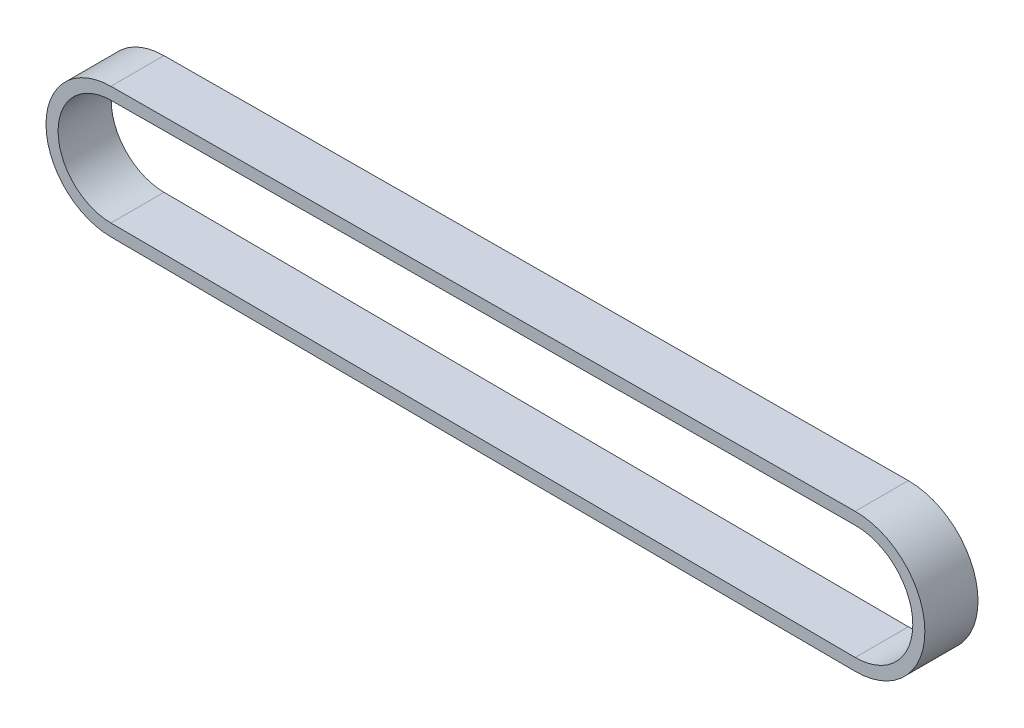
ISO-10303-21;
HEADER;
FILE_DESCRIPTION(('STEP AP214'),'2;1');
FILE_NAME('part.step','',(''),(''),'','','');
FILE_SCHEMA(('AUTOMOTIVE_DESIGN { 1 0 10303 214 1 1 1 1 }'));
ENDSEC;
DATA;
#1=APPLICATION_CONTEXT('core data for automotive mechanical design processes');
#2=APPLICATION_PROTOCOL_DEFINITION('international standard','automotive_design',2000,#1);
#3=PRODUCT_CONTEXT('',#1,'mechanical');
#4=PRODUCT('Part','Part','',(#3));
#5=PRODUCT_RELATED_PRODUCT_CATEGORY('part','',(#4));
#6=PRODUCT_DEFINITION_FORMATION('','',#4);
#7=PRODUCT_DEFINITION_CONTEXT('part definition',#1,'design');
#8=PRODUCT_DEFINITION('design','',#6,#7);
#9=PRODUCT_DEFINITION_SHAPE('','',#8);
#10=(LENGTH_UNIT() NAMED_UNIT(*) SI_UNIT(.MILLI.,.METRE.));
#11=(NAMED_UNIT(*) PLANE_ANGLE_UNIT() SI_UNIT($,.RADIAN.));
#12=(NAMED_UNIT(*) SI_UNIT($,.STERADIAN.) SOLID_ANGLE_UNIT());
#13=UNCERTAINTY_MEASURE_WITH_UNIT(LENGTH_MEASURE(1.E-05),#10,'distance_accuracy_value','');
#14=(GEOMETRIC_REPRESENTATION_CONTEXT(3) GLOBAL_UNCERTAINTY_ASSIGNED_CONTEXT((#13)) GLOBAL_UNIT_ASSIGNED_CONTEXT((#10,
#11,#12)) REPRESENTATION_CONTEXT('',''));
#15=CARTESIAN_POINT('',(0.,0.,0.));
#16=DIRECTION('',(0.,0.,1.));
#17=DIRECTION('',(1.,0.,0.));
#18=AXIS2_PLACEMENT_3D('',#15,#16,#17);
#19=CARTESIAN_POINT('',(-77.0499999974362,0.,11.));
#20=DIRECTION('',(0.,0.,1.));
#21=DIRECTION('',(1.,0.,0.));
#22=AXIS2_PLACEMENT_3D('',#19,#20,#21);
#23=PLANE('',#22);
#24=CARTESIAN_POINT('',(-77.0499999974362,0.,11.));
#25=DIRECTION('',(0.,0.,1.));
#26=DIRECTION('',(1.,0.,0.));
#27=AXIS2_PLACEMENT_3D('',#24,#25,#26);
#28=CIRCLE('',#27,13.4999999999998);
#29=CARTESIAN_POINT('',(-77.1244646307937,13.499794628748,11.));
#30=VERTEX_POINT('',#29);
#31=CARTESIAN_POINT('',(-77.1244646307937,-13.499794628748,11.));
#32=VERTEX_POINT('',#31);
#33=EDGE_CURVE('E137',#30,#32,#28,.T.);
#34=ORIENTED_EDGE('',*,*,#33,.T.);
#35=DIRECTION('',(0.999984787314682,-0.00551589876721858,0.));
#36=VECTOR('',#35,1.);
#37=CARTESIAN_POINT('',(-77.1244646307937,-13.499794628748,11.));
#38=LINE('',#37,#36);
#39=CARTESIAN_POINT('',(76.9708468501266,-14.3497816979656,11.));
#40=VERTEX_POINT('',#39);
#41=EDGE_CURVE('E140',#32,#40,#38,.T.);
#42=ORIENTED_EDGE('',*,*,#41,.T.);
#43=CARTESIAN_POINT('',(77.0499999974362,0.,11.));
#44=DIRECTION('',(0.,0.,1.));
#45=DIRECTION('',(1.,0.,0.));
#46=AXIS2_PLACEMENT_3D('',#43,#44,#45);
#47=CIRCLE('',#46,14.35);
#48=CARTESIAN_POINT('',(76.9708468501266,14.3497816979657,11.));
#49=VERTEX_POINT('',#48);
#50=EDGE_CURVE('E143',#40,#49,#47,.T.);
#51=ORIENTED_EDGE('',*,*,#50,.T.);
#52=DIRECTION('',(-0.999984787314682,-0.00551589876721897,0.));
#53=VECTOR('',#52,1.);
#54=CARTESIAN_POINT('',(-77.1244646307937,13.499794628748,11.));
#55=LINE('',#54,#53);
#56=EDGE_CURVE('E145',#49,#30,#55,.T.);
#57=ORIENTED_EDGE('',*,*,#56,.T.);
#58=EDGE_LOOP('',(#34,#42,#51,#57));
#59=FACE_BOUND('',#58,.T.);
#60=DIRECTION('',(-0.999984787314682,-0.00551589876721896,0.));
#61=VECTOR('',#60,1.);
#62=CARTESIAN_POINT('',(-77.1106748838756,10.9998326604614,11.));
#63=LINE('',#62,#61);
#64=CARTESIAN_POINT('',(76.9846365970447,11.849819729679,11.));
#65=VERTEX_POINT('',#64);
#66=CARTESIAN_POINT('',(-77.1106748838756,10.9998326604614,11.));
#67=VERTEX_POINT('',#66);
#68=EDGE_CURVE('E109',#65,#67,#63,.T.);
#69=ORIENTED_EDGE('',*,*,#68,.F.);
#70=CARTESIAN_POINT('',(77.0499999974362,0.,11.));
#71=DIRECTION('',(0.,0.,1.));
#72=DIRECTION('',(1.,0.,0.));
#73=AXIS2_PLACEMENT_3D('',#70,#71,#72);
#74=CIRCLE('',#73,11.85);
#75=CARTESIAN_POINT('',(76.9846365970447,-11.8498197296789,11.));
#76=VERTEX_POINT('',#75);
#77=EDGE_CURVE('E101',#76,#65,#74,.T.);
#78=ORIENTED_EDGE('',*,*,#77,.F.);
#79=DIRECTION('',(0.999984787314682,-0.00551589876721856,0.));
#80=VECTOR('',#79,1.);
#81=CARTESIAN_POINT('',(-77.1106748838756,-10.9998326604614,11.));
#82=LINE('',#81,#80);
#83=CARTESIAN_POINT('',(-77.1106748838756,-10.9998326604614,11.));
#84=VERTEX_POINT('',#83);
#85=EDGE_CURVE('E123',#84,#76,#82,.T.);
#86=ORIENTED_EDGE('',*,*,#85,.F.);
#87=CARTESIAN_POINT('',(-77.0499999974362,0.,11.));
#88=DIRECTION('',(0.,0.,1.));
#89=DIRECTION('',(1.,0.,0.));
#90=AXIS2_PLACEMENT_3D('',#87,#88,#89);
#91=CIRCLE('',#90,10.9999999999999);
#92=EDGE_CURVE('E121',#67,#84,#91,.T.);
#93=ORIENTED_EDGE('',*,*,#92,.F.);
#94=EDGE_LOOP('',(#69,#78,#86,#93));
#95=FACE_BOUND('',#94,.T.);
#96=ADVANCED_FACE('F36',(#59,#95),#23,.T.);
#97=CARTESIAN_POINT('',(-77.0499999974362,0.,0.));
#98=DIRECTION('',(0.,0.,1.));
#99=DIRECTION('',(1.,0.,0.));
#100=AXIS2_PLACEMENT_3D('',#97,#98,#99);
#101=PLANE('',#100);
#102=CARTESIAN_POINT('',(-77.0499999974362,0.,0.));
#103=DIRECTION('',(0.,0.,1.));
#104=DIRECTION('',(1.,0.,0.));
#105=AXIS2_PLACEMENT_3D('',#102,#103,#104);
#106=CIRCLE('',#105,13.4999999999998);
#107=CARTESIAN_POINT('',(-77.1244646307937,13.499794628748,0.));
#108=VERTEX_POINT('',#107);
#109=CARTESIAN_POINT('',(-77.1244646307937,-13.499794628748,0.));
#110=VERTEX_POINT('',#109);
#111=EDGE_CURVE('E117',#108,#110,#106,.T.);
#112=ORIENTED_EDGE('',*,*,#111,.F.);
#113=DIRECTION('',(-0.999984787314682,-0.00551589876721897,0.));
#114=VECTOR('',#113,1.);
#115=CARTESIAN_POINT('',(-77.1244646307937,13.499794628748,0.));
#116=LINE('',#115,#114);
#117=CARTESIAN_POINT('',(76.9708468501266,14.3497816979657,0.));
#118=VERTEX_POINT('',#117);
#119=EDGE_CURVE('E141',#118,#108,#116,.T.);
#120=ORIENTED_EDGE('',*,*,#119,.F.);
#121=CARTESIAN_POINT('',(77.0499999974362,0.,0.));
#122=DIRECTION('',(0.,0.,1.));
#123=DIRECTION('',(1.,0.,0.));
#124=AXIS2_PLACEMENT_3D('',#121,#122,#123);
#125=CIRCLE('',#124,14.35);
#126=CARTESIAN_POINT('',(76.9708468501266,-14.3497816979656,0.));
#127=VERTEX_POINT('',#126);
#128=EDGE_CURVE('E152',#127,#118,#125,.T.);
#129=ORIENTED_EDGE('',*,*,#128,.F.);
#130=DIRECTION('',(0.999984787314682,-0.00551589876721858,0.));
#131=VECTOR('',#130,1.);
#132=CARTESIAN_POINT('',(-77.1244646307937,-13.499794628748,0.));
#133=LINE('',#132,#131);
#134=EDGE_CURVE('E150',#110,#127,#133,.T.);
#135=ORIENTED_EDGE('',*,*,#134,.F.);
#136=EDGE_LOOP('',(#112,#120,#129,#135));
#137=FACE_BOUND('',#136,.T.);
#138=CARTESIAN_POINT('',(77.0499999974362,0.,0.));
#139=DIRECTION('',(0.,0.,1.));
#140=DIRECTION('',(1.,0.,0.));
#141=AXIS2_PLACEMENT_3D('',#138,#139,#140);
#142=CIRCLE('',#141,11.85);
#143=CARTESIAN_POINT('',(76.9846365970447,-11.8498197296789,0.));
#144=VERTEX_POINT('',#143);
#145=CARTESIAN_POINT('',(76.9846365970447,11.849819729679,0.));
#146=VERTEX_POINT('',#145);
#147=EDGE_CURVE('E59',#144,#146,#142,.T.);
#148=ORIENTED_EDGE('',*,*,#147,.T.);
#149=DIRECTION('',(-0.999984787314682,-0.00551589876721896,0.));
#150=VECTOR('',#149,1.);
#151=CARTESIAN_POINT('',(-77.1106748838756,10.9998326604614,0.));
#152=LINE('',#151,#150);
#153=CARTESIAN_POINT('',(-77.1106748838756,10.9998326604614,0.));
#154=VERTEX_POINT('',#153);
#155=EDGE_CURVE('E116',#146,#154,#152,.T.);
#156=ORIENTED_EDGE('',*,*,#155,.T.);
#157=CARTESIAN_POINT('',(-77.0499999974362,0.,0.));
#158=DIRECTION('',(0.,0.,1.));
#159=DIRECTION('',(1.,0.,0.));
#160=AXIS2_PLACEMENT_3D('',#157,#158,#159);
#161=CIRCLE('',#160,10.9999999999999);
#162=CARTESIAN_POINT('',(-77.1106748838756,-10.9998326604614,0.));
#163=VERTEX_POINT('',#162);
#164=EDGE_CURVE('E129',#154,#163,#161,.T.);
#165=ORIENTED_EDGE('',*,*,#164,.T.);
#166=DIRECTION('',(0.999984787314682,-0.00551589876721856,0.));
#167=VECTOR('',#166,1.);
#168=CARTESIAN_POINT('',(-77.1106748838756,-10.9998326604614,0.));
#169=LINE('',#168,#167);
#170=EDGE_CURVE('E110',#163,#144,#169,.T.);
#171=ORIENTED_EDGE('',*,*,#170,.T.);
#172=EDGE_LOOP('',(#148,#156,#165,#171));
#173=FACE_BOUND('',#172,.T.);
#174=ADVANCED_FACE('F170',(#137,#173),#101,.F.);
#175=CARTESIAN_POINT('',(-77.0499999974362,0.,11.));
#176=DIRECTION('',(0.,0.,-1.));
#177=DIRECTION('',(-1.,0.,0.));
#178=AXIS2_PLACEMENT_3D('',#175,#176,#177);
#179=CYLINDRICAL_SURFACE('',#178,13.4999999999998);
#180=ORIENTED_EDGE('',*,*,#111,.T.);
#181=DIRECTION('',(0.,0.,-1.));
#182=VECTOR('',#181,1.);
#183=CARTESIAN_POINT('',(-77.1244646307937,-13.499794628748,11.));
#184=LINE('',#183,#182);
#185=EDGE_CURVE('E11',#32,#110,#184,.T.);
#186=ORIENTED_EDGE('',*,*,#185,.F.);
#187=ORIENTED_EDGE('',*,*,#33,.F.);
#188=DIRECTION('',(0.,0.,-1.));
#189=VECTOR('',#188,1.);
#190=CARTESIAN_POINT('',(-77.1244646307937,13.499794628748,11.));
#191=LINE('',#190,#189);
#192=EDGE_CURVE('E147',#30,#108,#191,.T.);
#193=ORIENTED_EDGE('',*,*,#192,.T.);
#194=EDGE_LOOP('',(#180,#186,#187,#193));
#195=FACE_BOUND('',#194,.T.);
#196=ADVANCED_FACE('F38',(#195),#179,.T.);
#197=CARTESIAN_POINT('',(-77.1244646307937,-13.499794628748,11.));
#198=DIRECTION('',(0.00551589876721858,0.999984787314682,0.));
#199=DIRECTION('',(-0.999984787314682,0.00551589876721858,0.));
#200=AXIS2_PLACEMENT_3D('',#197,#198,#199);
#201=PLANE('',#200);
#202=ORIENTED_EDGE('',*,*,#134,.T.);
#203=DIRECTION('',(0.,0.,-1.));
#204=VECTOR('',#203,1.);
#205=CARTESIAN_POINT('',(76.9708468501266,-14.3497816979656,11.));
#206=LINE('',#205,#204);
#207=EDGE_CURVE('E44',#40,#127,#206,.T.);
#208=ORIENTED_EDGE('',*,*,#207,.F.);
#209=ORIENTED_EDGE('',*,*,#41,.F.);
#210=ORIENTED_EDGE('',*,*,#185,.T.);
#211=EDGE_LOOP('',(#202,#208,#209,#210));
#212=FACE_BOUND('',#211,.T.);
#213=ADVANCED_FACE('F180',(#212),#201,.F.);
#214=CARTESIAN_POINT('',(77.0499999974362,0.,11.));
#215=DIRECTION('',(0.,0.,-1.));
#216=DIRECTION('',(-1.,0.,0.));
#217=AXIS2_PLACEMENT_3D('',#214,#215,#216);
#218=CYLINDRICAL_SURFACE('',#217,14.35);
#219=ORIENTED_EDGE('',*,*,#128,.T.);
#220=DIRECTION('',(0.,0.,-1.));
#221=VECTOR('',#220,1.);
#222=CARTESIAN_POINT('',(76.9708468501266,14.3497816979657,11.));
#223=LINE('',#222,#221);
#224=EDGE_CURVE('E157',#49,#118,#223,.T.);
#225=ORIENTED_EDGE('',*,*,#224,.F.);
#226=ORIENTED_EDGE('',*,*,#50,.F.);
#227=ORIENTED_EDGE('',*,*,#207,.T.);
#228=EDGE_LOOP('',(#219,#225,#226,#227));
#229=FACE_BOUND('',#228,.T.);
#230=ADVANCED_FACE('F164',(#229),#218,.T.);
#231=CARTESIAN_POINT('',(-77.1244646307937,13.499794628748,11.));
#232=DIRECTION('',(0.00551589876721897,-0.999984787314682,0.));
#233=DIRECTION('',(0.999984787314682,0.00551589876721897,0.));
#234=AXIS2_PLACEMENT_3D('',#231,#232,#233);
#235=PLANE('',#234);
#236=ORIENTED_EDGE('',*,*,#119,.T.);
#237=ORIENTED_EDGE('',*,*,#192,.F.);
#238=ORIENTED_EDGE('',*,*,#56,.F.);
#239=ORIENTED_EDGE('',*,*,#224,.T.);
#240=EDGE_LOOP('',(#236,#237,#238,#239));
#241=FACE_BOUND('',#240,.T.);
#242=ADVANCED_FACE('F174',(#241),#235,.F.);
#243=CARTESIAN_POINT('',(77.0499999974362,0.,11.));
#244=DIRECTION('',(0.,0.,-1.));
#245=DIRECTION('',(-1.,0.,0.));
#246=AXIS2_PLACEMENT_3D('',#243,#244,#245);
#247=CYLINDRICAL_SURFACE('',#246,11.85);
#248=ORIENTED_EDGE('',*,*,#147,.F.);
#249=DIRECTION('',(0.,0.,-1.));
#250=VECTOR('',#249,1.);
#251=CARTESIAN_POINT('',(76.9846365970447,-11.8498197296789,11.));
#252=LINE('',#251,#250);
#253=EDGE_CURVE('E105',#76,#144,#252,.T.);
#254=ORIENTED_EDGE('',*,*,#253,.F.);
#255=ORIENTED_EDGE('',*,*,#77,.T.);
#256=DIRECTION('',(0.,0.,-1.));
#257=VECTOR('',#256,1.);
#258=CARTESIAN_POINT('',(76.9846365970447,11.849819729679,11.));
#259=LINE('',#258,#257);
#260=EDGE_CURVE('E104',#65,#146,#259,.T.);
#261=ORIENTED_EDGE('',*,*,#260,.T.);
#262=EDGE_LOOP('',(#248,#254,#255,#261));
#263=FACE_BOUND('',#262,.T.);
#264=ADVANCED_FACE('F103',(#263),#247,.F.);
#265=CARTESIAN_POINT('',(-77.1106748838756,10.9998326604614,11.));
#266=DIRECTION('',(0.00551589876721896,-0.999984787314682,0.));
#267=DIRECTION('',(0.999984787314682,0.00551589876721896,0.));
#268=AXIS2_PLACEMENT_3D('',#265,#266,#267);
#269=PLANE('',#268);
#270=ORIENTED_EDGE('',*,*,#155,.F.);
#271=ORIENTED_EDGE('',*,*,#260,.F.);
#272=ORIENTED_EDGE('',*,*,#68,.T.);
#273=DIRECTION('',(0.,0.,-1.));
#274=VECTOR('',#273,1.);
#275=CARTESIAN_POINT('',(-77.1106748838756,10.9998326604614,11.));
#276=LINE('',#275,#274);
#277=EDGE_CURVE('E118',#67,#154,#276,.T.);
#278=ORIENTED_EDGE('',*,*,#277,.T.);
#279=EDGE_LOOP('',(#270,#271,#272,#278));
#280=FACE_BOUND('',#279,.T.);
#281=ADVANCED_FACE('F113',(#280),#269,.T.);
#282=CARTESIAN_POINT('',(-77.0499999974362,0.,11.));
#283=DIRECTION('',(0.,0.,-1.));
#284=DIRECTION('',(-1.,0.,0.));
#285=AXIS2_PLACEMENT_3D('',#282,#283,#284);
#286=CYLINDRICAL_SURFACE('',#285,10.9999999999999);
#287=ORIENTED_EDGE('',*,*,#164,.F.);
#288=ORIENTED_EDGE('',*,*,#277,.F.);
#289=ORIENTED_EDGE('',*,*,#92,.T.);
#290=DIRECTION('',(0.,0.,-1.));
#291=VECTOR('',#290,1.);
#292=CARTESIAN_POINT('',(-77.1106748838756,-10.9998326604614,11.));
#293=LINE('',#292,#291);
#294=EDGE_CURVE('E51',#84,#163,#293,.T.);
#295=ORIENTED_EDGE('',*,*,#294,.T.);
#296=EDGE_LOOP('',(#287,#288,#289,#295));
#297=FACE_BOUND('',#296,.T.);
#298=ADVANCED_FACE('F203',(#297),#286,.F.);
#299=CARTESIAN_POINT('',(-77.1106748838756,-10.9998326604614,11.));
#300=DIRECTION('',(0.00551589876721856,0.999984787314682,0.));
#301=DIRECTION('',(-0.999984787314682,0.00551589876721856,0.));
#302=AXIS2_PLACEMENT_3D('',#299,#300,#301);
#303=PLANE('',#302);
#304=ORIENTED_EDGE('',*,*,#170,.F.);
#305=ORIENTED_EDGE('',*,*,#294,.F.);
#306=ORIENTED_EDGE('',*,*,#85,.T.);
#307=ORIENTED_EDGE('',*,*,#253,.T.);
#308=EDGE_LOOP('',(#304,#305,#306,#307));
#309=FACE_BOUND('',#308,.T.);
#310=ADVANCED_FACE('F207',(#309),#303,.T.);
#311=CLOSED_SHELL('',(#96,#174,#196,#213,#230,#242,#264,#281,#298,#310));
#312=MANIFOLD_SOLID_BREP('B2',#311);
#313=ADVANCED_BREP_SHAPE_REPRESENTATION('',(#18,#312),#14);
#314=SHAPE_DEFINITION_REPRESENTATION(#9,#313);
ENDSEC;
END-ISO-10303-21;
